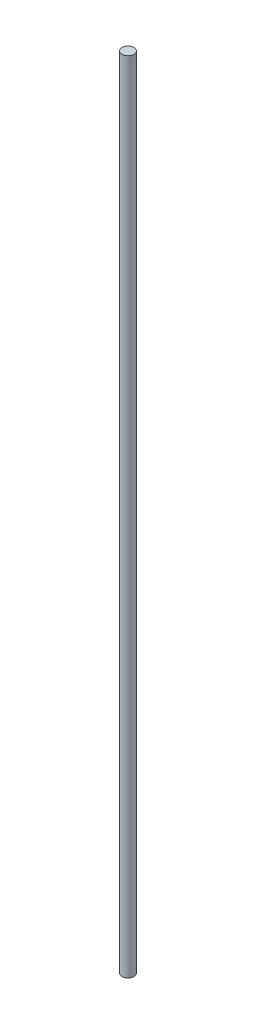
ISO-10303-21;
HEADER;
FILE_DESCRIPTION(('STEP AP214'),'2;1');
FILE_NAME('part.step','',(''),(''),'','','');
FILE_SCHEMA(('AUTOMOTIVE_DESIGN { 1 0 10303 214 1 1 1 1 }'));
ENDSEC;
DATA;
#1=APPLICATION_CONTEXT('core data for automotive mechanical design processes');
#2=APPLICATION_PROTOCOL_DEFINITION('international standard','automotive_design',2000,#1);
#3=PRODUCT_CONTEXT('',#1,'mechanical');
#4=PRODUCT('Part','Part','',(#3));
#5=PRODUCT_RELATED_PRODUCT_CATEGORY('part','',(#4));
#6=PRODUCT_DEFINITION_FORMATION('','',#4);
#7=PRODUCT_DEFINITION_CONTEXT('part definition',#1,'design');
#8=PRODUCT_DEFINITION('design','',#6,#7);
#9=PRODUCT_DEFINITION_SHAPE('','',#8);
#10=(LENGTH_UNIT() NAMED_UNIT(*) SI_UNIT(.MILLI.,.METRE.));
#11=(NAMED_UNIT(*) PLANE_ANGLE_UNIT() SI_UNIT($,.RADIAN.));
#12=(NAMED_UNIT(*) SI_UNIT($,.STERADIAN.) SOLID_ANGLE_UNIT());
#13=UNCERTAINTY_MEASURE_WITH_UNIT(LENGTH_MEASURE(1.E-05),#10,'distance_accuracy_value','');
#14=(GEOMETRIC_REPRESENTATION_CONTEXT(3) GLOBAL_UNCERTAINTY_ASSIGNED_CONTEXT((#13)) GLOBAL_UNIT_ASSIGNED_CONTEXT((#10,
#11,#12)) REPRESENTATION_CONTEXT('',''));
#15=CARTESIAN_POINT('',(0.,0.,0.));
#16=DIRECTION('',(0.,0.,1.));
#17=DIRECTION('',(1.,0.,0.));
#18=AXIS2_PLACEMENT_3D('',#15,#16,#17);
#19=CARTESIAN_POINT('',(0.,1002.,0.));
#20=DIRECTION('',(0.,-1.,0.));
#21=DIRECTION('',(0.,0.,-1.));
#22=AXIS2_PLACEMENT_3D('',#19,#20,#21);
#23=CYLINDRICAL_SURFACE('',#22,7.5);
#24=CARTESIAN_POINT('',(0.,1002.,0.));
#25=DIRECTION('',(0.,1.,0.));
#26=DIRECTION('',(0.,0.,1.));
#27=AXIS2_PLACEMENT_3D('',#24,#25,#26);
#28=CIRCLE('',#27,7.5);
#29=CARTESIAN_POINT('',(0.,1002.,7.5));
#30=VERTEX_POINT('',#29);
#31=EDGE_CURVE('E10',#30,#30,#28,.T.);
#32=ORIENTED_EDGE('',*,*,#31,.F.);
#33=EDGE_LOOP('',(#32));
#34=FACE_BOUND('',#33,.T.);
#35=CARTESIAN_POINT('',(0.,0.,0.));
#36=DIRECTION('',(0.,1.,0.));
#37=DIRECTION('',(0.,0.,1.));
#38=AXIS2_PLACEMENT_3D('',#35,#36,#37);
#39=CIRCLE('',#38,7.5);
#40=CARTESIAN_POINT('',(0.,0.,7.5));
#41=VERTEX_POINT('',#40);
#42=EDGE_CURVE('E40',#41,#41,#39,.T.);
#43=ORIENTED_EDGE('',*,*,#42,.T.);
#44=EDGE_LOOP('',(#43));
#45=FACE_BOUND('',#44,.T.);
#46=ADVANCED_FACE('F37',(#34,#45),#23,.T.);
#47=CARTESIAN_POINT('',(0.,1002.,0.));
#48=DIRECTION('',(0.,1.,0.));
#49=DIRECTION('',(0.,0.,1.));
#50=AXIS2_PLACEMENT_3D('',#47,#48,#49);
#51=PLANE('',#50);
#52=ORIENTED_EDGE('',*,*,#31,.T.);
#53=EDGE_LOOP('',(#52));
#54=FACE_BOUND('',#53,.T.);
#55=ADVANCED_FACE('F54',(#54),#51,.T.);
#56=CARTESIAN_POINT('',(0.,0.,0.));
#57=DIRECTION('',(0.,1.,0.));
#58=DIRECTION('',(0.,0.,1.));
#59=AXIS2_PLACEMENT_3D('',#56,#57,#58);
#60=PLANE('',#59);
#61=ORIENTED_EDGE('',*,*,#42,.F.);
#62=EDGE_LOOP('',(#61));
#63=FACE_BOUND('',#62,.T.);
#64=ADVANCED_FACE('F52',(#63),#60,.F.);
#65=CLOSED_SHELL('',(#46,#55,#64));
#66=MANIFOLD_SOLID_BREP('B2',#65);
#67=ADVANCED_BREP_SHAPE_REPRESENTATION('',(#18,#66),#14);
#68=SHAPE_DEFINITION_REPRESENTATION(#9,#67);
ENDSEC;
END-ISO-10303-21;
